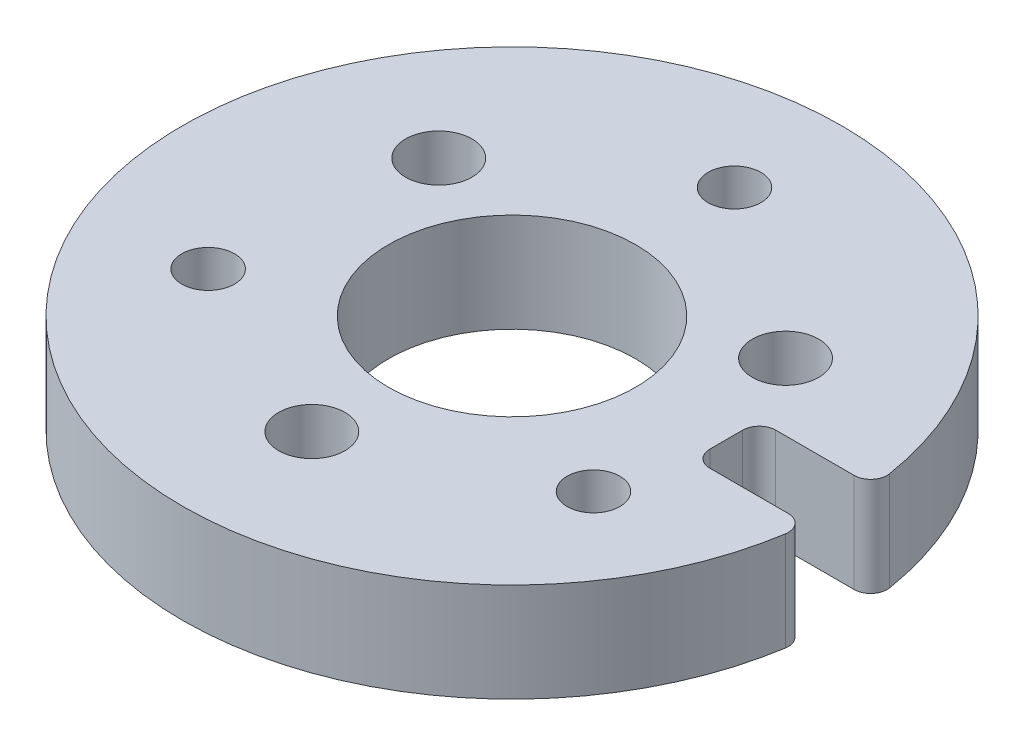
ISO-10303-21;
HEADER;
FILE_DESCRIPTION(('STEP AP214'),'2;1');
FILE_NAME('part.step','',(''),(''),'','','');
FILE_SCHEMA(('AUTOMOTIVE_DESIGN { 1 0 10303 214 1 1 1 1 }'));
ENDSEC;
DATA;
#1=APPLICATION_CONTEXT('core data for automotive mechanical design processes');
#2=APPLICATION_PROTOCOL_DEFINITION('international standard','automotive_design',2000,#1);
#3=PRODUCT_CONTEXT('',#1,'mechanical');
#4=PRODUCT('Part','Part','',(#3));
#5=PRODUCT_RELATED_PRODUCT_CATEGORY('part','',(#4));
#6=PRODUCT_DEFINITION_FORMATION('','',#4);
#7=PRODUCT_DEFINITION_CONTEXT('part definition',#1,'design');
#8=PRODUCT_DEFINITION('design','',#6,#7);
#9=PRODUCT_DEFINITION_SHAPE('','',#8);
#10=(LENGTH_UNIT() NAMED_UNIT(*) SI_UNIT(.MILLI.,.METRE.));
#11=(NAMED_UNIT(*) PLANE_ANGLE_UNIT() SI_UNIT($,.RADIAN.));
#12=(NAMED_UNIT(*) SI_UNIT($,.STERADIAN.) SOLID_ANGLE_UNIT());
#13=UNCERTAINTY_MEASURE_WITH_UNIT(LENGTH_MEASURE(1.E-05),#10,'distance_accuracy_value','');
#14=(GEOMETRIC_REPRESENTATION_CONTEXT(3) GLOBAL_UNCERTAINTY_ASSIGNED_CONTEXT((#13)) GLOBAL_UNIT_ASSIGNED_CONTEXT((#10,
#11,#12)) REPRESENTATION_CONTEXT('',''));
#15=CARTESIAN_POINT('',(0.,0.,0.));
#16=DIRECTION('',(0.,0.,1.));
#17=DIRECTION('',(1.,0.,0.));
#18=AXIS2_PLACEMENT_3D('',#15,#16,#17);
#19=CARTESIAN_POINT('',(0.,6.,-13.5));
#20=DIRECTION('',(0.,-1.,0.));
#21=DIRECTION('',(0.,0.,-1.));
#22=AXIS2_PLACEMENT_3D('',#19,#20,#21);
#23=CYLINDRICAL_SURFACE('',#22,1.6);
#24=CARTESIAN_POINT('',(0.,6.,-13.5));
#25=DIRECTION('',(0.,1.,0.));
#26=DIRECTION('',(0.,0.,1.));
#27=AXIS2_PLACEMENT_3D('',#24,#25,#26);
#28=CIRCLE('',#27,1.6);
#29=CARTESIAN_POINT('',(0.,6.,-11.9));
#30=VERTEX_POINT('',#29);
#31=EDGE_CURVE('E131',#30,#30,#28,.T.);
#32=ORIENTED_EDGE('',*,*,#31,.T.);
#33=EDGE_LOOP('',(#32));
#34=FACE_BOUND('',#33,.T.);
#35=CARTESIAN_POINT('',(0.,0.,-13.5));
#36=DIRECTION('',(0.,1.,0.));
#37=DIRECTION('',(0.,0.,1.));
#38=AXIS2_PLACEMENT_3D('',#35,#36,#37);
#39=CIRCLE('',#38,1.6);
#40=CARTESIAN_POINT('',(0.,0.,-11.9));
#41=VERTEX_POINT('',#40);
#42=EDGE_CURVE('E181',#41,#41,#39,.T.);
#43=ORIENTED_EDGE('',*,*,#42,.F.);
#44=EDGE_LOOP('',(#43));
#45=FACE_BOUND('',#44,.T.);
#46=ADVANCED_FACE('F43',(#34,#45),#23,.F.);
#47=CARTESIAN_POINT('',(11.6913429510899,6.,6.75000000000005));
#48=DIRECTION('',(0.,-1.,0.));
#49=DIRECTION('',(0.,0.,-1.));
#50=AXIS2_PLACEMENT_3D('',#47,#48,#49);
#51=CYLINDRICAL_SURFACE('',#50,1.6);
#52=CARTESIAN_POINT('',(11.6913429510899,6.,6.75000000000005));
#53=DIRECTION('',(0.,1.,0.));
#54=DIRECTION('',(0.,0.,1.));
#55=AXIS2_PLACEMENT_3D('',#52,#53,#54);
#56=CIRCLE('',#55,1.6);
#57=CARTESIAN_POINT('',(11.6913429510899,6.,8.35000000000005));
#58=VERTEX_POINT('',#57);
#59=EDGE_CURVE('E203',#58,#58,#56,.T.);
#60=ORIENTED_EDGE('',*,*,#59,.T.);
#61=EDGE_LOOP('',(#60));
#62=FACE_BOUND('',#61,.T.);
#63=CARTESIAN_POINT('',(11.6913429510899,0.,6.75000000000005));
#64=DIRECTION('',(0.,1.,0.));
#65=DIRECTION('',(0.,0.,1.));
#66=AXIS2_PLACEMENT_3D('',#63,#64,#65);
#67=CIRCLE('',#66,1.6);
#68=CARTESIAN_POINT('',(11.6913429510899,0.,8.35000000000005));
#69=VERTEX_POINT('',#68);
#70=EDGE_CURVE('E184',#69,#69,#67,.T.);
#71=ORIENTED_EDGE('',*,*,#70,.F.);
#72=EDGE_LOOP('',(#71));
#73=FACE_BOUND('',#72,.T.);
#74=ADVANCED_FACE('F241',(#62,#73),#51,.F.);
#75=CARTESIAN_POINT('',(-11.69134295109,6.,6.74999999999989));
#76=DIRECTION('',(0.,-1.,0.));
#77=DIRECTION('',(0.,0.,-1.));
#78=AXIS2_PLACEMENT_3D('',#75,#76,#77);
#79=CYLINDRICAL_SURFACE('',#78,1.6);
#80=CARTESIAN_POINT('',(-11.69134295109,6.,6.74999999999989));
#81=DIRECTION('',(0.,1.,0.));
#82=DIRECTION('',(0.,0.,1.));
#83=AXIS2_PLACEMENT_3D('',#80,#81,#82);
#84=CIRCLE('',#83,1.6);
#85=CARTESIAN_POINT('',(-11.69134295109,6.,8.34999999999989));
#86=VERTEX_POINT('',#85);
#87=EDGE_CURVE('E206',#86,#86,#84,.T.);
#88=ORIENTED_EDGE('',*,*,#87,.T.);
#89=EDGE_LOOP('',(#88));
#90=FACE_BOUND('',#89,.T.);
#91=CARTESIAN_POINT('',(-11.69134295109,0.,6.74999999999989));
#92=DIRECTION('',(0.,1.,0.));
#93=DIRECTION('',(0.,0.,1.));
#94=AXIS2_PLACEMENT_3D('',#91,#92,#93);
#95=CIRCLE('',#94,1.6);
#96=CARTESIAN_POINT('',(-11.69134295109,0.,8.34999999999989));
#97=VERTEX_POINT('',#96);
#98=EDGE_CURVE('E187',#97,#97,#95,.T.);
#99=ORIENTED_EDGE('',*,*,#98,.F.);
#100=EDGE_LOOP('',(#99));
#101=FACE_BOUND('',#100,.T.);
#102=ADVANCED_FACE('F247',(#90,#101),#79,.F.);
#103=CARTESIAN_POINT('',(0.,6.,0.));
#104=DIRECTION('',(0.,-1.,0.));
#105=DIRECTION('',(0.,0.,-1.));
#106=AXIS2_PLACEMENT_3D('',#103,#104,#105);
#107=CYLINDRICAL_SURFACE('',#106,7.5);
#108=CARTESIAN_POINT('',(0.,6.,0.));
#109=DIRECTION('',(0.,1.,0.));
#110=DIRECTION('',(0.,0.,1.));
#111=AXIS2_PLACEMENT_3D('',#108,#109,#110);
#112=CIRCLE('',#111,7.5);
#113=CARTESIAN_POINT('',(0.,6.,7.5));
#114=VERTEX_POINT('',#113);
#115=EDGE_CURVE('E209',#114,#114,#112,.T.);
#116=ORIENTED_EDGE('',*,*,#115,.T.);
#117=EDGE_LOOP('',(#116));
#118=FACE_BOUND('',#117,.T.);
#119=CARTESIAN_POINT('',(0.,0.,0.));
#120=DIRECTION('',(0.,1.,0.));
#121=DIRECTION('',(0.,0.,1.));
#122=AXIS2_PLACEMENT_3D('',#119,#120,#121);
#123=CIRCLE('',#122,7.5);
#124=CARTESIAN_POINT('',(0.,0.,7.5));
#125=VERTEX_POINT('',#124);
#126=EDGE_CURVE('E190',#125,#125,#123,.T.);
#127=ORIENTED_EDGE('',*,*,#126,.F.);
#128=EDGE_LOOP('',(#127));
#129=FACE_BOUND('',#128,.T.);
#130=ADVANCED_FACE('F256',(#118,#129),#107,.F.);
#131=CARTESIAN_POINT('',(-10.5222086559809,6.,-6.07500000000001));
#132=DIRECTION('',(0.,-1.,0.));
#133=DIRECTION('',(0.,0.,-1.));
#134=AXIS2_PLACEMENT_3D('',#131,#132,#133);
#135=CYLINDRICAL_SURFACE('',#134,2.015);
#136=CARTESIAN_POINT('',(-10.5222086559809,6.,-6.07500000000001));
#137=DIRECTION('',(0.,1.,0.));
#138=DIRECTION('',(0.,0.,1.));
#139=AXIS2_PLACEMENT_3D('',#136,#137,#138);
#140=CIRCLE('',#139,2.015);
#141=CARTESIAN_POINT('',(-10.5222086559809,6.,-4.06000000000001));
#142=VERTEX_POINT('',#141);
#143=EDGE_CURVE('E212',#142,#142,#140,.T.);
#144=ORIENTED_EDGE('',*,*,#143,.T.);
#145=EDGE_LOOP('',(#144));
#146=FACE_BOUND('',#145,.T.);
#147=CARTESIAN_POINT('',(-10.5222086559809,0.,-6.07500000000001));
#148=DIRECTION('',(0.,1.,0.));
#149=DIRECTION('',(0.,0.,1.));
#150=AXIS2_PLACEMENT_3D('',#147,#148,#149);
#151=CIRCLE('',#150,2.015);
#152=CARTESIAN_POINT('',(-10.5222086559809,0.,-4.06000000000001));
#153=VERTEX_POINT('',#152);
#154=EDGE_CURVE('E193',#153,#153,#151,.T.);
#155=ORIENTED_EDGE('',*,*,#154,.F.);
#156=EDGE_LOOP('',(#155));
#157=FACE_BOUND('',#156,.T.);
#158=ADVANCED_FACE('F260',(#146,#157),#135,.F.);
#159=CARTESIAN_POINT('',(10.5222086559809,6.,-6.07499999999999));
#160=DIRECTION('',(0.,-1.,0.));
#161=DIRECTION('',(0.,0.,-1.));
#162=AXIS2_PLACEMENT_3D('',#159,#160,#161);
#163=CYLINDRICAL_SURFACE('',#162,2.015);
#164=CARTESIAN_POINT('',(10.5222086559809,6.,-6.07499999999999));
#165=DIRECTION('',(0.,1.,0.));
#166=DIRECTION('',(0.,0.,1.));
#167=AXIS2_PLACEMENT_3D('',#164,#165,#166);
#168=CIRCLE('',#167,2.015);
#169=CARTESIAN_POINT('',(10.5222086559809,6.,-4.05999999999999));
#170=VERTEX_POINT('',#169);
#171=EDGE_CURVE('E215',#170,#170,#168,.T.);
#172=ORIENTED_EDGE('',*,*,#171,.T.);
#173=EDGE_LOOP('',(#172));
#174=FACE_BOUND('',#173,.T.);
#175=CARTESIAN_POINT('',(10.5222086559809,0.,-6.07499999999999));
#176=DIRECTION('',(0.,1.,0.));
#177=DIRECTION('',(0.,0.,1.));
#178=AXIS2_PLACEMENT_3D('',#175,#176,#177);
#179=CIRCLE('',#178,2.015);
#180=CARTESIAN_POINT('',(10.5222086559809,0.,-4.05999999999999));
#181=VERTEX_POINT('',#180);
#182=EDGE_CURVE('E196',#181,#181,#179,.T.);
#183=ORIENTED_EDGE('',*,*,#182,.F.);
#184=EDGE_LOOP('',(#183));
#185=FACE_BOUND('',#184,.T.);
#186=ADVANCED_FACE('F264',(#174,#185),#163,.F.);
#187=CARTESIAN_POINT('',(0.,6.,12.15));
#188=DIRECTION('',(0.,-1.,0.));
#189=DIRECTION('',(0.,0.,-1.));
#190=AXIS2_PLACEMENT_3D('',#187,#188,#189);
#191=CYLINDRICAL_SURFACE('',#190,2.015);
#192=CARTESIAN_POINT('',(0.,6.,12.15));
#193=DIRECTION('',(0.,1.,0.));
#194=DIRECTION('',(0.,0.,1.));
#195=AXIS2_PLACEMENT_3D('',#192,#193,#194);
#196=CIRCLE('',#195,2.015);
#197=CARTESIAN_POINT('',(0.,6.,14.165));
#198=VERTEX_POINT('',#197);
#199=EDGE_CURVE('E180',#198,#198,#196,.T.);
#200=ORIENTED_EDGE('',*,*,#199,.T.);
#201=EDGE_LOOP('',(#200));
#202=FACE_BOUND('',#201,.T.);
#203=CARTESIAN_POINT('',(0.,0.,12.15));
#204=DIRECTION('',(0.,1.,0.));
#205=DIRECTION('',(0.,0.,1.));
#206=AXIS2_PLACEMENT_3D('',#203,#204,#205);
#207=CIRCLE('',#206,2.015);
#208=CARTESIAN_POINT('',(0.,0.,14.165));
#209=VERTEX_POINT('',#208);
#210=EDGE_CURVE('E170',#209,#209,#207,.T.);
#211=ORIENTED_EDGE('',*,*,#210,.F.);
#212=EDGE_LOOP('',(#211));
#213=FACE_BOUND('',#212,.T.);
#214=ADVANCED_FACE('F268',(#202,#213),#191,.F.);
#215=CARTESIAN_POINT('',(0.,6.,0.));
#216=DIRECTION('',(0.,-1.,0.));
#217=DIRECTION('',(0.,0.,-1.));
#218=AXIS2_PLACEMENT_3D('',#215,#216,#217);
#219=CYLINDRICAL_SURFACE('',#218,20.);
#220=CARTESIAN_POINT('',(0.,0.,0.));
#221=DIRECTION('',(0.,1.,0.));
#222=DIRECTION('',(0.,0.,1.));
#223=AXIS2_PLACEMENT_3D('',#220,#221,#222);
#224=CIRCLE('',#223,20.);
#225=CARTESIAN_POINT('',(19.7491189887302,0.,-3.15789473684211));
#226=VERTEX_POINT('',#225);
#227=CARTESIAN_POINT('',(19.7491189887302,0.,3.15789473684211));
#228=VERTEX_POINT('',#227);
#229=EDGE_CURVE('E178',#226,#228,#224,.T.);
#230=ORIENTED_EDGE('',*,*,#229,.T.);
#231=DIRECTION('',(0.,-1.,0.));
#232=VECTOR('',#231,1.);
#233=CARTESIAN_POINT('',(19.7491189887302,6.,3.15789473684211));
#234=LINE('',#233,#232);
#235=CARTESIAN_POINT('',(19.7491189887302,6.,3.15789473684211));
#236=VERTEX_POINT('',#235);
#237=EDGE_CURVE('E120',#228,#236,#234,.F.);
#238=ORIENTED_EDGE('',*,*,#237,.T.);
#239=CARTESIAN_POINT('',(0.,6.,0.));
#240=DIRECTION('',(0.,1.,0.));
#241=DIRECTION('',(0.,0.,1.));
#242=AXIS2_PLACEMENT_3D('',#239,#240,#241);
#243=CIRCLE('',#242,20.);
#244=CARTESIAN_POINT('',(19.7491189887302,6.,-3.15789473684211));
#245=VERTEX_POINT('',#244);
#246=EDGE_CURVE('E113',#245,#236,#243,.T.);
#247=ORIENTED_EDGE('',*,*,#246,.F.);
#248=DIRECTION('',(0.,-1.,0.));
#249=VECTOR('',#248,1.);
#250=CARTESIAN_POINT('',(19.7491189887302,6.,-3.15789473684211));
#251=LINE('',#250,#249);
#252=EDGE_CURVE('E127',#245,#226,#251,.T.);
#253=ORIENTED_EDGE('',*,*,#252,.T.);
#254=EDGE_LOOP('',(#230,#238,#247,#253));
#255=FACE_BOUND('',#254,.T.);
#256=ADVANCED_FACE('F126',(#255),#219,.T.);
#257=CARTESIAN_POINT('',(0.,6.,0.));
#258=DIRECTION('',(0.,1.,0.));
#259=DIRECTION('',(0.,0.,1.));
#260=AXIS2_PLACEMENT_3D('',#257,#258,#259);
#261=PLANE('',#260);
#262=ORIENTED_EDGE('',*,*,#246,.T.);
#263=CARTESIAN_POINT('',(18.7616630392937,6.,3.));
#264=DIRECTION('',(0.,1.,0.));
#265=DIRECTION('',(0.,0.,1.));
#266=AXIS2_PLACEMENT_3D('',#263,#264,#265);
#267=CIRCLE('',#266,1.);
#268=CARTESIAN_POINT('',(18.7616630392937,6.,2.));
#269=VERTEX_POINT('',#268);
#270=EDGE_CURVE('E119',#236,#269,#267,.T.);
#271=ORIENTED_EDGE('',*,*,#270,.T.);
#272=DIRECTION('',(1.,0.,0.));
#273=VECTOR('',#272,1.);
#274=CARTESIAN_POINT('',(13.,6.,2.));
#275=LINE('',#274,#273);
#276=CARTESIAN_POINT('',(14.,6.,2.));
#277=VERTEX_POINT('',#276);
#278=EDGE_CURVE('E171',#277,#269,#275,.T.);
#279=ORIENTED_EDGE('',*,*,#278,.F.);
#280=CARTESIAN_POINT('',(14.,6.,1.));
#281=DIRECTION('',(0.,1.,0.));
#282=DIRECTION('',(0.,0.,1.));
#283=AXIS2_PLACEMENT_3D('',#280,#281,#282);
#284=CIRCLE('',#283,1.);
#285=CARTESIAN_POINT('',(13.,6.,1.));
#286=VERTEX_POINT('',#285);
#287=EDGE_CURVE('E159',#277,#286,#284,.F.);
#288=ORIENTED_EDGE('',*,*,#287,.T.);
#289=DIRECTION('',(0.,0.,1.));
#290=VECTOR('',#289,1.);
#291=CARTESIAN_POINT('',(13.,6.,-2.));
#292=LINE('',#291,#290);
#293=CARTESIAN_POINT('',(13.,6.,-1.));
#294=VERTEX_POINT('',#293);
#295=EDGE_CURVE('E163',#294,#286,#292,.T.);
#296=ORIENTED_EDGE('',*,*,#295,.F.);
#297=CARTESIAN_POINT('',(14.,6.,-1.));
#298=DIRECTION('',(0.,1.,0.));
#299=DIRECTION('',(0.,0.,1.));
#300=AXIS2_PLACEMENT_3D('',#297,#298,#299);
#301=CIRCLE('',#300,1.);
#302=CARTESIAN_POINT('',(14.,6.,-2.));
#303=VERTEX_POINT('',#302);
#304=EDGE_CURVE('E51',#294,#303,#301,.F.);
#305=ORIENTED_EDGE('',*,*,#304,.T.);
#306=DIRECTION('',(-1.,0.,0.));
#307=VECTOR('',#306,1.);
#308=CARTESIAN_POINT('',(13.,6.,-2.));
#309=LINE('',#308,#307);
#310=CARTESIAN_POINT('',(18.7616630392937,6.,-2.));
#311=VERTEX_POINT('',#310);
#312=EDGE_CURVE('E115',#311,#303,#309,.T.);
#313=ORIENTED_EDGE('',*,*,#312,.F.);
#314=CARTESIAN_POINT('',(18.7616630392937,6.,-3.));
#315=DIRECTION('',(0.,1.,0.));
#316=DIRECTION('',(0.,0.,1.));
#317=AXIS2_PLACEMENT_3D('',#314,#315,#316);
#318=CIRCLE('',#317,1.);
#319=EDGE_CURVE('E109',#311,#245,#318,.T.);
#320=ORIENTED_EDGE('',*,*,#319,.T.);
#321=EDGE_LOOP('',(#262,#271,#279,#288,#296,#305,#313,#320));
#322=FACE_BOUND('',#321,.T.);
#323=ORIENTED_EDGE('',*,*,#199,.F.);
#324=EDGE_LOOP('',(#323));
#325=FACE_BOUND('',#324,.T.);
#326=ORIENTED_EDGE('',*,*,#171,.F.);
#327=EDGE_LOOP('',(#326));
#328=FACE_BOUND('',#327,.T.);
#329=ORIENTED_EDGE('',*,*,#143,.F.);
#330=EDGE_LOOP('',(#329));
#331=FACE_BOUND('',#330,.T.);
#332=ORIENTED_EDGE('',*,*,#115,.F.);
#333=EDGE_LOOP('',(#332));
#334=FACE_BOUND('',#333,.T.);
#335=ORIENTED_EDGE('',*,*,#87,.F.);
#336=EDGE_LOOP('',(#335));
#337=FACE_BOUND('',#336,.T.);
#338=ORIENTED_EDGE('',*,*,#59,.F.);
#339=EDGE_LOOP('',(#338));
#340=FACE_BOUND('',#339,.T.);
#341=ORIENTED_EDGE('',*,*,#31,.F.);
#342=EDGE_LOOP('',(#341));
#343=FACE_BOUND('',#342,.T.);
#344=ADVANCED_FACE('F111',(#322,#325,#328,#331,#334,#337,#340,#343),#261,.T.);
#345=CARTESIAN_POINT('',(0.,0.,0.));
#346=DIRECTION('',(0.,1.,0.));
#347=DIRECTION('',(0.,0.,1.));
#348=AXIS2_PLACEMENT_3D('',#345,#346,#347);
#349=PLANE('',#348);
#350=ORIENTED_EDGE('',*,*,#210,.T.);
#351=EDGE_LOOP('',(#350));
#352=FACE_BOUND('',#351,.T.);
#353=ORIENTED_EDGE('',*,*,#182,.T.);
#354=EDGE_LOOP('',(#353));
#355=FACE_BOUND('',#354,.T.);
#356=ORIENTED_EDGE('',*,*,#154,.T.);
#357=EDGE_LOOP('',(#356));
#358=FACE_BOUND('',#357,.T.);
#359=ORIENTED_EDGE('',*,*,#126,.T.);
#360=EDGE_LOOP('',(#359));
#361=FACE_BOUND('',#360,.T.);
#362=ORIENTED_EDGE('',*,*,#98,.T.);
#363=EDGE_LOOP('',(#362));
#364=FACE_BOUND('',#363,.T.);
#365=ORIENTED_EDGE('',*,*,#70,.T.);
#366=EDGE_LOOP('',(#365));
#367=FACE_BOUND('',#366,.T.);
#368=ORIENTED_EDGE('',*,*,#42,.T.);
#369=EDGE_LOOP('',(#368));
#370=FACE_BOUND('',#369,.T.);
#371=DIRECTION('',(1.,0.,0.));
#372=VECTOR('',#371,1.);
#373=CARTESIAN_POINT('',(0.,0.,2.));
#374=LINE('',#373,#372);
#375=CARTESIAN_POINT('',(14.,0.,2.));
#376=VERTEX_POINT('',#375);
#377=CARTESIAN_POINT('',(18.7616630392937,0.,2.));
#378=VERTEX_POINT('',#377);
#379=EDGE_CURVE('E130',#376,#378,#374,.T.);
#380=ORIENTED_EDGE('',*,*,#379,.T.);
#381=CARTESIAN_POINT('',(18.7616630392937,0.,3.));
#382=DIRECTION('',(0.,1.,0.));
#383=DIRECTION('',(0.,0.,1.));
#384=AXIS2_PLACEMENT_3D('',#381,#382,#383);
#385=CIRCLE('',#384,1.);
#386=EDGE_CURVE('E149',#378,#228,#385,.F.);
#387=ORIENTED_EDGE('',*,*,#386,.T.);
#388=ORIENTED_EDGE('',*,*,#229,.F.);
#389=CARTESIAN_POINT('',(18.7616630392937,0.,-3.));
#390=DIRECTION('',(0.,1.,0.));
#391=DIRECTION('',(0.,0.,1.));
#392=AXIS2_PLACEMENT_3D('',#389,#390,#391);
#393=CIRCLE('',#392,1.);
#394=CARTESIAN_POINT('',(18.7616630392937,0.,-2.));
#395=VERTEX_POINT('',#394);
#396=EDGE_CURVE('E134',#226,#395,#393,.F.);
#397=ORIENTED_EDGE('',*,*,#396,.T.);
#398=DIRECTION('',(-1.,0.,0.));
#399=VECTOR('',#398,1.);
#400=CARTESIAN_POINT('',(0.,0.,-2.));
#401=LINE('',#400,#399);
#402=CARTESIAN_POINT('',(14.,0.,-2.));
#403=VERTEX_POINT('',#402);
#404=EDGE_CURVE('E135',#395,#403,#401,.T.);
#405=ORIENTED_EDGE('',*,*,#404,.T.);
#406=CARTESIAN_POINT('',(14.,0.,-1.));
#407=DIRECTION('',(0.,1.,0.));
#408=DIRECTION('',(0.,0.,1.));
#409=AXIS2_PLACEMENT_3D('',#406,#407,#408);
#410=CIRCLE('',#409,1.);
#411=CARTESIAN_POINT('',(13.,0.,-1.));
#412=VERTEX_POINT('',#411);
#413=EDGE_CURVE('E11',#403,#412,#410,.T.);
#414=ORIENTED_EDGE('',*,*,#413,.T.);
#415=DIRECTION('',(0.,0.,1.));
#416=VECTOR('',#415,1.);
#417=CARTESIAN_POINT('',(13.,0.,0.));
#418=LINE('',#417,#416);
#419=CARTESIAN_POINT('',(13.,0.,1.));
#420=VERTEX_POINT('',#419);
#421=EDGE_CURVE('E138',#412,#420,#418,.T.);
#422=ORIENTED_EDGE('',*,*,#421,.T.);
#423=CARTESIAN_POINT('',(14.,0.,1.));
#424=DIRECTION('',(0.,1.,0.));
#425=DIRECTION('',(0.,0.,1.));
#426=AXIS2_PLACEMENT_3D('',#423,#424,#425);
#427=CIRCLE('',#426,1.);
#428=EDGE_CURVE('E161',#420,#376,#427,.T.);
#429=ORIENTED_EDGE('',*,*,#428,.T.);
#430=EDGE_LOOP('',(#380,#387,#388,#397,#405,#414,#422,#429));
#431=FACE_BOUND('',#430,.T.);
#432=ADVANCED_FACE('F231',(#352,#355,#358,#361,#364,#367,#370,#431),#349,.F.);
#433=CARTESIAN_POINT('',(13.,-4.,-2.));
#434=DIRECTION('',(-1.,0.,0.));
#435=DIRECTION('',(0.,0.,1.));
#436=AXIS2_PLACEMENT_3D('',#433,#434,#435);
#437=PLANE('',#436);
#438=ORIENTED_EDGE('',*,*,#295,.T.);
#439=DIRECTION('',(0.,1.,0.));
#440=VECTOR('',#439,1.);
#441=CARTESIAN_POINT('',(13.,0.,1.));
#442=LINE('',#441,#440);
#443=EDGE_CURVE('E58',#286,#420,#442,.F.);
#444=ORIENTED_EDGE('',*,*,#443,.T.);
#445=ORIENTED_EDGE('',*,*,#421,.F.);
#446=DIRECTION('',(0.,1.,0.));
#447=VECTOR('',#446,1.);
#448=CARTESIAN_POINT('',(13.,6.,-1.));
#449=LINE('',#448,#447);
#450=EDGE_CURVE('E155',#412,#294,#449,.T.);
#451=ORIENTED_EDGE('',*,*,#450,.T.);
#452=EDGE_LOOP('',(#438,#444,#445,#451));
#453=FACE_BOUND('',#452,.T.);
#454=ADVANCED_FACE('F173',(#453),#437,.F.);
#455=CARTESIAN_POINT('',(13.,-4.,-2.));
#456=DIRECTION('',(0.,0.,-1.));
#457=DIRECTION('',(-1.,0.,0.));
#458=AXIS2_PLACEMENT_3D('',#455,#456,#457);
#459=PLANE('',#458);
#460=ORIENTED_EDGE('',*,*,#404,.F.);
#461=DIRECTION('',(0.,-1.,0.));
#462=VECTOR('',#461,1.);
#463=CARTESIAN_POINT('',(18.7616630392937,-4.,-2.));
#464=LINE('',#463,#462);
#465=EDGE_CURVE('E153',#395,#311,#464,.F.);
#466=ORIENTED_EDGE('',*,*,#465,.T.);
#467=ORIENTED_EDGE('',*,*,#312,.T.);
#468=DIRECTION('',(0.,1.,0.));
#469=VECTOR('',#468,1.);
#470=CARTESIAN_POINT('',(14.,0.,-2.));
#471=LINE('',#470,#469);
#472=EDGE_CURVE('E151',#303,#403,#471,.F.);
#473=ORIENTED_EDGE('',*,*,#472,.T.);
#474=EDGE_LOOP('',(#460,#466,#467,#473));
#475=FACE_BOUND('',#474,.T.);
#476=ADVANCED_FACE('F169',(#475),#459,.F.);
#477=CARTESIAN_POINT('',(13.,-4.,2.));
#478=DIRECTION('',(0.,0.,1.));
#479=DIRECTION('',(1.,0.,0.));
#480=AXIS2_PLACEMENT_3D('',#477,#478,#479);
#481=PLANE('',#480);
#482=ORIENTED_EDGE('',*,*,#278,.T.);
#483=DIRECTION('',(0.,-1.,0.));
#484=VECTOR('',#483,1.);
#485=CARTESIAN_POINT('',(18.7616630392937,-4.,2.));
#486=LINE('',#485,#484);
#487=EDGE_CURVE('E146',#269,#378,#486,.T.);
#488=ORIENTED_EDGE('',*,*,#487,.T.);
#489=ORIENTED_EDGE('',*,*,#379,.F.);
#490=DIRECTION('',(0.,1.,0.));
#491=VECTOR('',#490,1.);
#492=CARTESIAN_POINT('',(14.,6.,2.));
#493=LINE('',#492,#491);
#494=EDGE_CURVE('E143',#376,#277,#493,.T.);
#495=ORIENTED_EDGE('',*,*,#494,.T.);
#496=EDGE_LOOP('',(#482,#488,#489,#495));
#497=FACE_BOUND('',#496,.T.);
#498=ADVANCED_FACE('F225',(#497),#481,.F.);
#499=CARTESIAN_POINT('',(18.7616630392937,6.,3.));
#500=DIRECTION('',(0.,-1.,0.));
#501=DIRECTION('',(0.,0.,-1.));
#502=AXIS2_PLACEMENT_3D('',#499,#500,#501);
#503=CYLINDRICAL_SURFACE('',#502,1.);
#504=ORIENTED_EDGE('',*,*,#386,.F.);
#505=ORIENTED_EDGE('',*,*,#487,.F.);
#506=ORIENTED_EDGE('',*,*,#270,.F.);
#507=ORIENTED_EDGE('',*,*,#237,.F.);
#508=EDGE_LOOP('',(#504,#505,#506,#507));
#509=FACE_BOUND('',#508,.T.);
#510=ADVANCED_FACE('F230',(#509),#503,.T.);
#511=CARTESIAN_POINT('',(18.7616630392937,6.,-3.));
#512=DIRECTION('',(0.,-1.,0.));
#513=DIRECTION('',(0.,0.,-1.));
#514=AXIS2_PLACEMENT_3D('',#511,#512,#513);
#515=CYLINDRICAL_SURFACE('',#514,1.);
#516=ORIENTED_EDGE('',*,*,#319,.F.);
#517=ORIENTED_EDGE('',*,*,#465,.F.);
#518=ORIENTED_EDGE('',*,*,#396,.F.);
#519=ORIENTED_EDGE('',*,*,#252,.F.);
#520=EDGE_LOOP('',(#516,#517,#518,#519));
#521=FACE_BOUND('',#520,.T.);
#522=ADVANCED_FACE('F133',(#521),#515,.T.);
#523=CARTESIAN_POINT('',(14.,-4.,1.));
#524=DIRECTION('',(0.,-1.,0.));
#525=DIRECTION('',(0.,0.,-1.));
#526=AXIS2_PLACEMENT_3D('',#523,#524,#525);
#527=CYLINDRICAL_SURFACE('',#526,1.);
#528=ORIENTED_EDGE('',*,*,#428,.F.);
#529=ORIENTED_EDGE('',*,*,#443,.F.);
#530=ORIENTED_EDGE('',*,*,#287,.F.);
#531=ORIENTED_EDGE('',*,*,#494,.F.);
#532=EDGE_LOOP('',(#528,#529,#530,#531));
#533=FACE_BOUND('',#532,.T.);
#534=ADVANCED_FACE('F233',(#533),#527,.F.);
#535=CARTESIAN_POINT('',(14.,-4.,-1.));
#536=DIRECTION('',(0.,-1.,0.));
#537=DIRECTION('',(0.,0.,-1.));
#538=AXIS2_PLACEMENT_3D('',#535,#536,#537);
#539=CYLINDRICAL_SURFACE('',#538,1.);
#540=ORIENTED_EDGE('',*,*,#413,.F.);
#541=ORIENTED_EDGE('',*,*,#472,.F.);
#542=ORIENTED_EDGE('',*,*,#304,.F.);
#543=ORIENTED_EDGE('',*,*,#450,.F.);
#544=EDGE_LOOP('',(#540,#541,#542,#543));
#545=FACE_BOUND('',#544,.T.);
#546=ADVANCED_FACE('F45',(#545),#539,.F.);
#547=CLOSED_SHELL('',(#46,#74,#102,#130,#158,#186,#214,#256,#344,#432,#454,#476,#498,#510,#522,
#534,#546));
#548=MANIFOLD_SOLID_BREP('B2',#547);
#549=ADVANCED_BREP_SHAPE_REPRESENTATION('',(#18,#548),#14);
#550=SHAPE_DEFINITION_REPRESENTATION(#9,#549);
ENDSEC;
END-ISO-10303-21;
